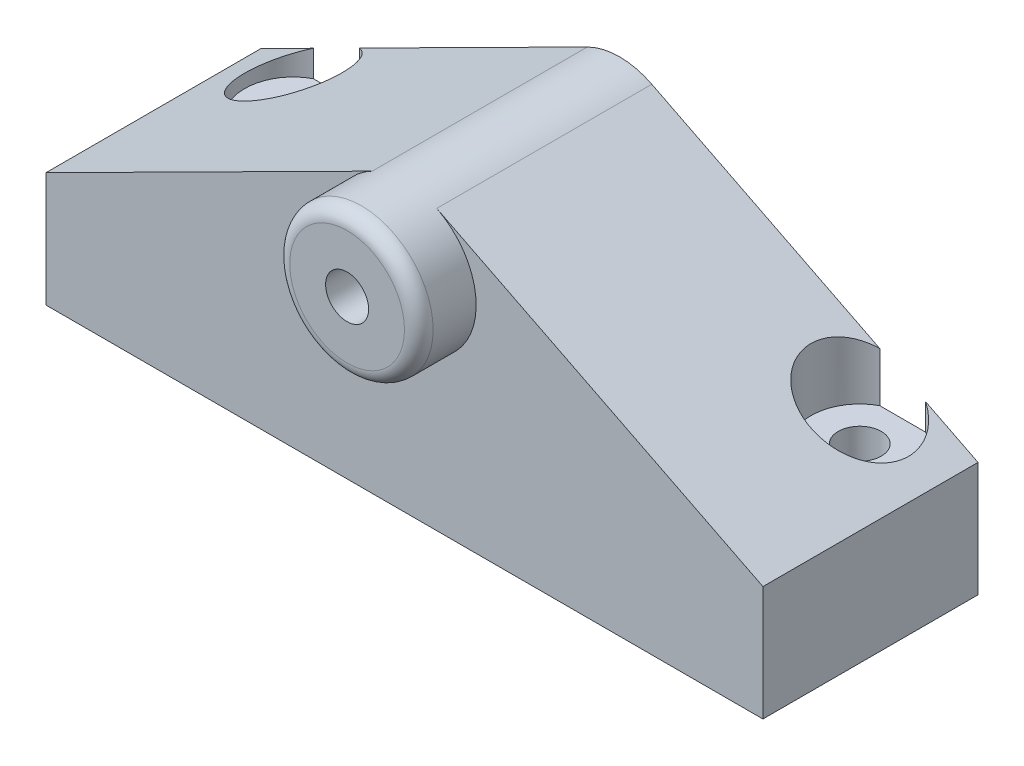
ISO-10303-21;
HEADER;
FILE_DESCRIPTION(('STEP AP214'),'2;1');
FILE_NAME('part.step','',(''),(''),'','','');
FILE_SCHEMA(('AUTOMOTIVE_DESIGN { 1 0 10303 214 1 1 1 1 }'));
ENDSEC;
DATA;
#1=APPLICATION_CONTEXT('core data for automotive mechanical design processes');
#2=APPLICATION_PROTOCOL_DEFINITION('international standard','automotive_design',2000,#1);
#3=PRODUCT_CONTEXT('',#1,'mechanical');
#4=PRODUCT('Part','Part','',(#3));
#5=PRODUCT_RELATED_PRODUCT_CATEGORY('part','',(#4));
#6=PRODUCT_DEFINITION_FORMATION('','',#4);
#7=PRODUCT_DEFINITION_CONTEXT('part definition',#1,'design');
#8=PRODUCT_DEFINITION('design','',#6,#7);
#9=PRODUCT_DEFINITION_SHAPE('','',#8);
#10=(LENGTH_UNIT() NAMED_UNIT(*) SI_UNIT(.MILLI.,.METRE.));
#11=(NAMED_UNIT(*) PLANE_ANGLE_UNIT() SI_UNIT($,.RADIAN.));
#12=(NAMED_UNIT(*) SI_UNIT($,.STERADIAN.) SOLID_ANGLE_UNIT());
#13=UNCERTAINTY_MEASURE_WITH_UNIT(LENGTH_MEASURE(1.E-05),#10,'distance_accuracy_value','');
#14=(GEOMETRIC_REPRESENTATION_CONTEXT(3) GLOBAL_UNCERTAINTY_ASSIGNED_CONTEXT((#13)) GLOBAL_UNIT_ASSIGNED_CONTEXT((#10,
#11,#12)) REPRESENTATION_CONTEXT('',''));
#15=CARTESIAN_POINT('',(0.,0.,0.));
#16=DIRECTION('',(0.,0.,1.));
#17=DIRECTION('',(1.,0.,0.));
#18=AXIS2_PLACEMENT_3D('',#15,#16,#17);
#19=CARTESIAN_POINT('',(25.0000000000154,14.9999999999695,15.));
#20=DIRECTION('',(0.,0.,1.));
#21=DIRECTION('',(1.,0.,0.));
#22=AXIS2_PLACEMENT_3D('',#19,#20,#21);
#23=PLANE('',#22);
#24=CARTESIAN_POINT('',(25.0000000000154,14.9999999999695,15.));
#25=DIRECTION('',(0.,0.,1.));
#26=DIRECTION('',(1.,0.,0.));
#27=AXIS2_PLACEMENT_3D('',#24,#25,#26);
#28=CIRCLE('',#27,5.);
#29=CARTESIAN_POINT('',(22.749789697054,19.4650367962845,15.));
#30=VERTEX_POINT('',#29);
#31=CARTESIAN_POINT('',(27.2502103029767,19.4650367962845,15.));
#32=VERTEX_POINT('',#31);
#33=EDGE_CURVE('E149',#30,#32,#28,.T.);
#34=ORIENTED_EDGE('',*,*,#33,.F.);
#35=DIRECTION('',(-0.893007359262992,-0.450042060592271,0.));
#36=VECTOR('',#35,1.);
#37=CARTESIAN_POINT('',(0.,8.,15.));
#38=LINE('',#37,#36);
#39=CARTESIAN_POINT('',(0.,8.,15.));
#40=VERTEX_POINT('',#39);
#41=EDGE_CURVE('E168',#30,#40,#38,.T.);
#42=ORIENTED_EDGE('',*,*,#41,.T.);
#43=DIRECTION('',(0.,-1.,0.));
#44=VECTOR('',#43,1.);
#45=CARTESIAN_POINT('',(0.,0.,15.));
#46=LINE('',#45,#44);
#47=CARTESIAN_POINT('',(0.,0.,15.));
#48=VERTEX_POINT('',#47);
#49=EDGE_CURVE('E157',#40,#48,#46,.T.);
#50=ORIENTED_EDGE('',*,*,#49,.T.);
#51=DIRECTION('',(1.,0.,0.));
#52=VECTOR('',#51,1.);
#53=CARTESIAN_POINT('',(0.,0.,15.));
#54=LINE('',#53,#52);
#55=CARTESIAN_POINT('',(50.0000000000308,0.,15.));
#56=VERTEX_POINT('',#55);
#57=EDGE_CURVE('E160',#48,#56,#54,.T.);
#58=ORIENTED_EDGE('',*,*,#57,.T.);
#59=DIRECTION('',(0.,1.,0.));
#60=VECTOR('',#59,1.);
#61=CARTESIAN_POINT('',(50.0000000000308,0.,15.));
#62=LINE('',#61,#60);
#63=CARTESIAN_POINT('',(50.0000000000308,8.,15.));
#64=VERTEX_POINT('',#63);
#65=EDGE_CURVE('E163',#56,#64,#62,.T.);
#66=ORIENTED_EDGE('',*,*,#65,.T.);
#67=DIRECTION('',(-0.893007359262992,0.450042060592271,0.));
#68=VECTOR('',#67,1.);
#69=CARTESIAN_POINT('',(50.0000000000308,8.,15.));
#70=LINE('',#69,#68);
#71=EDGE_CURVE('E165',#64,#32,#70,.T.);
#72=ORIENTED_EDGE('',*,*,#71,.T.);
#73=EDGE_LOOP('',(#34,#42,#50,#58,#66,#72));
#74=FACE_BOUND('',#73,.T.);
#75=ADVANCED_FACE('F32',(#74),#23,.T.);
#76=CARTESIAN_POINT('',(25.0000000000154,14.9999999999695,0.));
#77=DIRECTION('',(0.,0.,1.));
#78=DIRECTION('',(1.,0.,0.));
#79=AXIS2_PLACEMENT_3D('',#76,#77,#78);
#80=PLANE('',#79);
#81=DIRECTION('',(-0.893007359262992,-0.450042060592271,0.));
#82=VECTOR('',#81,1.);
#83=CARTESIAN_POINT('',(0.,8.,0.));
#84=LINE('',#83,#82);
#85=CARTESIAN_POINT('',(3.65000000001537,9.83946246817541,0.));
#86=VERTEX_POINT('',#85);
#87=CARTESIAN_POINT('',(0.,8.,0.));
#88=VERTEX_POINT('',#87);
#89=EDGE_CURVE('E183',#86,#88,#84,.T.);
#90=ORIENTED_EDGE('',*,*,#89,.F.);
#91=DIRECTION('',(0.,-1.,0.));
#92=VECTOR('',#91,1.);
#93=CARTESIAN_POINT('',(3.65000000001537,27.,0.));
#94=LINE('',#93,#92);
#95=CARTESIAN_POINT('',(3.65000000001537,8.,0.));
#96=VERTEX_POINT('',#95);
#97=EDGE_CURVE('E47',#86,#96,#94,.T.);
#98=ORIENTED_EDGE('',*,*,#97,.T.);
#99=DIRECTION('',(1.,0.,0.));
#100=VECTOR('',#99,1.);
#101=CARTESIAN_POINT('',(25.0000000000154,8.,0.));
#102=LINE('',#101,#100);
#103=CARTESIAN_POINT('',(6.85000000001537,8.,0.));
#104=VERTEX_POINT('',#103);
#105=EDGE_CURVE('E116',#96,#104,#102,.T.);
#106=ORIENTED_EDGE('',*,*,#105,.T.);
#107=DIRECTION('',(0.,-1.,0.));
#108=VECTOR('',#107,1.);
#109=CARTESIAN_POINT('',(6.85000000001537,27.,0.));
#110=LINE('',#109,#108);
#111=CARTESIAN_POINT('',(6.85000000001537,11.4521418923224,0.));
#112=VERTEX_POINT('',#111);
#113=EDGE_CURVE('E108',#104,#112,#110,.F.);
#114=ORIENTED_EDGE('',*,*,#113,.T.);
#115=CARTESIAN_POINT('',(22.749789697054,19.4650367962845,0.));
#116=VERTEX_POINT('',#115);
#117=EDGE_CURVE('E161',#116,#112,#84,.T.);
#118=ORIENTED_EDGE('',*,*,#117,.F.);
#119=CARTESIAN_POINT('',(25.0000000000154,14.9999999999695,0.));
#120=DIRECTION('',(0.,0.,1.));
#121=DIRECTION('',(1.,0.,0.));
#122=AXIS2_PLACEMENT_3D('',#119,#120,#121);
#123=CIRCLE('',#122,5.);
#124=CARTESIAN_POINT('',(27.2502103029767,19.4650367962845,0.));
#125=VERTEX_POINT('',#124);
#126=EDGE_CURVE('E181',#125,#116,#123,.T.);
#127=ORIENTED_EDGE('',*,*,#126,.F.);
#128=DIRECTION('',(-0.893007359262992,0.450042060592271,0.));
#129=VECTOR('',#128,1.);
#130=CARTESIAN_POINT('',(50.0000000000308,8.,0.));
#131=LINE('',#130,#129);
#132=CARTESIAN_POINT('',(43.1500000000154,11.4521418923224,0.));
#133=VERTEX_POINT('',#132);
#134=EDGE_CURVE('E177',#133,#125,#131,.T.);
#135=ORIENTED_EDGE('',*,*,#134,.F.);
#136=DIRECTION('',(0.,-1.,0.));
#137=VECTOR('',#136,1.);
#138=CARTESIAN_POINT('',(43.1500000000154,27.,0.));
#139=LINE('',#138,#137);
#140=CARTESIAN_POINT('',(43.1500000000154,8.,0.));
#141=VERTEX_POINT('',#140);
#142=EDGE_CURVE('E54',#133,#141,#139,.T.);
#143=ORIENTED_EDGE('',*,*,#142,.T.);
#144=DIRECTION('',(1.,0.,0.));
#145=VECTOR('',#144,1.);
#146=CARTESIAN_POINT('',(25.0000000000154,8.,0.));
#147=LINE('',#146,#145);
#148=CARTESIAN_POINT('',(46.3500000000154,8.,0.));
#149=VERTEX_POINT('',#148);
#150=EDGE_CURVE('E132',#141,#149,#147,.T.);
#151=ORIENTED_EDGE('',*,*,#150,.T.);
#152=DIRECTION('',(0.,-1.,0.));
#153=VECTOR('',#152,1.);
#154=CARTESIAN_POINT('',(46.3500000000154,27.,0.));
#155=LINE('',#154,#153);
#156=CARTESIAN_POINT('',(46.3500000000154,9.83946246817541,0.));
#157=VERTEX_POINT('',#156);
#158=EDGE_CURVE('E135',#149,#157,#155,.F.);
#159=ORIENTED_EDGE('',*,*,#158,.T.);
#160=CARTESIAN_POINT('',(50.0000000000308,8.,0.));
#161=VERTEX_POINT('',#160);
#162=EDGE_CURVE('E178',#161,#157,#131,.T.);
#163=ORIENTED_EDGE('',*,*,#162,.F.);
#164=DIRECTION('',(0.,1.,0.));
#165=VECTOR('',#164,1.);
#166=CARTESIAN_POINT('',(50.0000000000308,0.,0.));
#167=LINE('',#166,#165);
#168=CARTESIAN_POINT('',(50.0000000000308,0.,0.));
#169=VERTEX_POINT('',#168);
#170=EDGE_CURVE('E175',#169,#161,#167,.T.);
#171=ORIENTED_EDGE('',*,*,#170,.F.);
#172=DIRECTION('',(1.,0.,0.));
#173=VECTOR('',#172,1.);
#174=CARTESIAN_POINT('',(0.,0.,0.));
#175=LINE('',#174,#173);
#176=CARTESIAN_POINT('',(0.,0.,0.));
#177=VERTEX_POINT('',#176);
#178=EDGE_CURVE('E173',#177,#169,#175,.T.);
#179=ORIENTED_EDGE('',*,*,#178,.F.);
#180=DIRECTION('',(0.,-1.,0.));
#181=VECTOR('',#180,1.);
#182=CARTESIAN_POINT('',(0.,0.,0.));
#183=LINE('',#182,#181);
#184=EDGE_CURVE('E156',#88,#177,#183,.T.);
#185=ORIENTED_EDGE('',*,*,#184,.F.);
#186=EDGE_LOOP('',(#90,#98,#106,#114,#118,#127,#135,#143,#151,#159,#163,#171,#179,#185));
#187=FACE_BOUND('',#186,.T.);
#188=CARTESIAN_POINT('',(25.0000000000154,14.9999999999695,0.));
#189=DIRECTION('',(0.,0.,1.));
#190=DIRECTION('',(1.,0.,0.));
#191=AXIS2_PLACEMENT_3D('',#188,#189,#190);
#192=CIRCLE('',#191,1.5);
#193=CARTESIAN_POINT('',(26.5000000000154,14.9999999999695,0.));
#194=VERTEX_POINT('',#193);
#195=EDGE_CURVE('E148',#194,#194,#192,.T.);
#196=ORIENTED_EDGE('',*,*,#195,.T.);
#197=EDGE_LOOP('',(#196));
#198=FACE_BOUND('',#197,.T.);
#199=ADVANCED_FACE('F123',(#187,#198),#80,.F.);
#200=CARTESIAN_POINT('',(0.,0.,15.));
#201=DIRECTION('',(1.,0.,0.));
#202=DIRECTION('',(0.,0.,-1.));
#203=AXIS2_PLACEMENT_3D('',#200,#201,#202);
#204=PLANE('',#203);
#205=ORIENTED_EDGE('',*,*,#184,.T.);
#206=DIRECTION('',(0.,0.,-1.));
#207=VECTOR('',#206,1.);
#208=CARTESIAN_POINT('',(0.,0.,15.));
#209=LINE('',#208,#207);
#210=EDGE_CURVE('E153',#48,#177,#209,.T.);
#211=ORIENTED_EDGE('',*,*,#210,.F.);
#212=ORIENTED_EDGE('',*,*,#49,.F.);
#213=DIRECTION('',(0.,0.,-1.));
#214=VECTOR('',#213,1.);
#215=CARTESIAN_POINT('',(0.,8.,15.));
#216=LINE('',#215,#214);
#217=EDGE_CURVE('E170',#40,#88,#216,.T.);
#218=ORIENTED_EDGE('',*,*,#217,.T.);
#219=EDGE_LOOP('',(#205,#211,#212,#218));
#220=FACE_BOUND('',#219,.T.);
#221=ADVANCED_FACE('F249',(#220),#204,.F.);
#222=CARTESIAN_POINT('',(0.,0.,15.));
#223=DIRECTION('',(0.,1.,0.));
#224=DIRECTION('',(0.,0.,1.));
#225=AXIS2_PLACEMENT_3D('',#222,#223,#224);
#226=PLANE('',#225);
#227=CARTESIAN_POINT('',(44.7500000000154,0.,3.));
#228=DIRECTION('',(0.,-1.,0.));
#229=DIRECTION('',(0.,0.,-1.));
#230=AXIS2_PLACEMENT_3D('',#227,#228,#229);
#231=CIRCLE('',#230,1.5);
#232=CARTESIAN_POINT('',(44.7500000000154,0.,1.5));
#233=VERTEX_POINT('',#232);
#234=EDGE_CURVE('E139',#233,#233,#231,.T.);
#235=ORIENTED_EDGE('',*,*,#234,.F.);
#236=EDGE_LOOP('',(#235));
#237=FACE_BOUND('',#236,.T.);
#238=CARTESIAN_POINT('',(5.25000000001537,0.,3.));
#239=DIRECTION('',(0.,-1.,0.));
#240=DIRECTION('',(0.,0.,-1.));
#241=AXIS2_PLACEMENT_3D('',#238,#239,#240);
#242=CIRCLE('',#241,1.5);
#243=CARTESIAN_POINT('',(5.25000000001537,0.,1.5));
#244=VERTEX_POINT('',#243);
#245=EDGE_CURVE('E142',#244,#244,#242,.T.);
#246=ORIENTED_EDGE('',*,*,#245,.F.);
#247=EDGE_LOOP('',(#246));
#248=FACE_BOUND('',#247,.T.);
#249=ORIENTED_EDGE('',*,*,#178,.T.);
#250=DIRECTION('',(0.,0.,-1.));
#251=VECTOR('',#250,1.);
#252=CARTESIAN_POINT('',(50.0000000000308,0.,15.));
#253=LINE('',#252,#251);
#254=EDGE_CURVE('E196',#56,#169,#253,.T.);
#255=ORIENTED_EDGE('',*,*,#254,.F.);
#256=ORIENTED_EDGE('',*,*,#57,.F.);
#257=ORIENTED_EDGE('',*,*,#210,.T.);
#258=EDGE_LOOP('',(#249,#255,#256,#257));
#259=FACE_BOUND('',#258,.T.);
#260=ADVANCED_FACE('F265',(#237,#248,#259),#226,.F.);
#261=CARTESIAN_POINT('',(50.0000000000308,0.,15.));
#262=DIRECTION('',(-1.,0.,0.));
#263=DIRECTION('',(0.,0.,1.));
#264=AXIS2_PLACEMENT_3D('',#261,#262,#263);
#265=PLANE('',#264);
#266=ORIENTED_EDGE('',*,*,#170,.T.);
#267=DIRECTION('',(0.,0.,-1.));
#268=VECTOR('',#267,1.);
#269=CARTESIAN_POINT('',(50.0000000000308,8.,15.));
#270=LINE('',#269,#268);
#271=EDGE_CURVE('E193',#64,#161,#270,.T.);
#272=ORIENTED_EDGE('',*,*,#271,.F.);
#273=ORIENTED_EDGE('',*,*,#65,.F.);
#274=ORIENTED_EDGE('',*,*,#254,.T.);
#275=EDGE_LOOP('',(#266,#272,#273,#274));
#276=FACE_BOUND('',#275,.T.);
#277=ADVANCED_FACE('F262',(#276),#265,.F.);
#278=CARTESIAN_POINT('',(50.0000000000308,8.,15.));
#279=DIRECTION('',(-0.450042060592271,-0.893007359262992,0.));
#280=DIRECTION('',(0.893007359262992,-0.450042060592272,0.));
#281=AXIS2_PLACEMENT_3D('',#278,#279,#280);
#282=PLANE('',#281);
#283=ORIENTED_EDGE('',*,*,#162,.T.);
#284=CARTESIAN_POINT('',(44.7500000000154,10.6458021802489,3.));
#285=DIRECTION('',(-0.450042060592271,-0.893007359262992,0.));
#286=DIRECTION('',(0.893007359262992,-0.450042060592272,0.));
#287=AXIS2_PLACEMENT_3D('',#284,#285,#286);
#288=ELLIPSE('',#287,3.80735944080691,3.4);
#289=EDGE_CURVE('E40',#157,#133,#288,.T.);
#290=ORIENTED_EDGE('',*,*,#289,.T.);
#291=ORIENTED_EDGE('',*,*,#134,.T.);
#292=DIRECTION('',(0.,0.,-1.));
#293=VECTOR('',#292,1.);
#294=CARTESIAN_POINT('',(27.2502103029767,19.4650367962845,15.));
#295=LINE('',#294,#293);
#296=EDGE_CURVE('E190',#32,#125,#295,.T.);
#297=ORIENTED_EDGE('',*,*,#296,.F.);
#298=ORIENTED_EDGE('',*,*,#71,.F.);
#299=ORIENTED_EDGE('',*,*,#271,.T.);
#300=EDGE_LOOP('',(#283,#290,#291,#297,#298,#299));
#301=FACE_BOUND('',#300,.T.);
#302=ADVANCED_FACE('F210',(#301),#282,.F.);
#303=CARTESIAN_POINT('',(25.0000000000154,14.9999999999695,15.));
#304=DIRECTION('',(0.,0.,-1.));
#305=DIRECTION('',(-1.,0.,0.));
#306=AXIS2_PLACEMENT_3D('',#303,#304,#305);
#307=CYLINDRICAL_SURFACE('',#306,5.);
#308=CARTESIAN_POINT('',(25.0000000000154,14.9999999999695,18.));
#309=DIRECTION('',(0.,0.,1.));
#310=DIRECTION('',(1.,0.,0.));
#311=AXIS2_PLACEMENT_3D('',#308,#309,#310);
#312=CIRCLE('',#311,5.);
#313=CARTESIAN_POINT('',(30.0000000000154,14.9999999999695,18.));
#314=VERTEX_POINT('',#313);
#315=EDGE_CURVE('E203',#314,#314,#312,.F.);
#316=ORIENTED_EDGE('',*,*,#315,.T.);
#317=EDGE_LOOP('',(#316));
#318=FACE_BOUND('',#317,.T.);
#319=ORIENTED_EDGE('',*,*,#126,.T.);
#320=DIRECTION('',(0.,0.,-1.));
#321=VECTOR('',#320,1.);
#322=CARTESIAN_POINT('',(22.749789697054,19.4650367962845,15.));
#323=LINE('',#322,#321);
#324=EDGE_CURVE('E187',#30,#116,#323,.T.);
#325=ORIENTED_EDGE('',*,*,#324,.F.);
#326=ORIENTED_EDGE('',*,*,#33,.T.);
#327=ORIENTED_EDGE('',*,*,#296,.T.);
#328=EDGE_LOOP('',(#319,#325,#326,#327));
#329=FACE_BOUND('',#328,.T.);
#330=ADVANCED_FACE('F215',(#318,#329),#307,.T.);
#331=CARTESIAN_POINT('',(0.,8.,15.));
#332=DIRECTION('',(0.450042060592271,-0.893007359262992,0.));
#333=DIRECTION('',(0.893007359262992,0.450042060592272,0.));
#334=AXIS2_PLACEMENT_3D('',#331,#332,#333);
#335=PLANE('',#334);
#336=ORIENTED_EDGE('',*,*,#117,.T.);
#337=CARTESIAN_POINT('',(5.25000000001537,10.6458021802489,3.));
#338=DIRECTION('',(0.450042060592271,-0.893007359262992,0.));
#339=DIRECTION('',(-0.893007359262992,-0.450042060592272,0.));
#340=AXIS2_PLACEMENT_3D('',#337,#338,#339);
#341=ELLIPSE('',#340,3.80735944080691,3.4);
#342=EDGE_CURVE('E11',#112,#86,#341,.T.);
#343=ORIENTED_EDGE('',*,*,#342,.T.);
#344=ORIENTED_EDGE('',*,*,#89,.T.);
#345=ORIENTED_EDGE('',*,*,#217,.F.);
#346=ORIENTED_EDGE('',*,*,#41,.F.);
#347=ORIENTED_EDGE('',*,*,#324,.T.);
#348=EDGE_LOOP('',(#336,#343,#344,#345,#346,#347));
#349=FACE_BOUND('',#348,.T.);
#350=ADVANCED_FACE('F218',(#349),#335,.F.);
#351=CARTESIAN_POINT('',(25.0000000000154,14.9999999999695,15.));
#352=DIRECTION('',(0.,0.,-1.));
#353=DIRECTION('',(-1.,0.,0.));
#354=AXIS2_PLACEMENT_3D('',#351,#352,#353);
#355=CYLINDRICAL_SURFACE('',#354,1.5);
#356=ORIENTED_EDGE('',*,*,#195,.F.);
#357=EDGE_LOOP('',(#356));
#358=FACE_BOUND('',#357,.T.);
#359=CARTESIAN_POINT('',(25.0000000000154,14.9999999999695,19.));
#360=DIRECTION('',(0.,0.,1.));
#361=DIRECTION('',(1.,0.,0.));
#362=AXIS2_PLACEMENT_3D('',#359,#360,#361);
#363=CIRCLE('',#362,1.5);
#364=CARTESIAN_POINT('',(26.5000000000154,14.9999999999695,19.));
#365=VERTEX_POINT('',#364);
#366=EDGE_CURVE('E145',#365,#365,#363,.T.);
#367=ORIENTED_EDGE('',*,*,#366,.T.);
#368=EDGE_LOOP('',(#367));
#369=FACE_BOUND('',#368,.T.);
#370=ADVANCED_FACE('F252',(#358,#369),#355,.F.);
#371=CARTESIAN_POINT('',(25.0000000000154,14.9999999999695,19.));
#372=DIRECTION('',(0.,0.,1.));
#373=DIRECTION('',(1.,0.,0.));
#374=AXIS2_PLACEMENT_3D('',#371,#372,#373);
#375=PLANE('',#374);
#376=CARTESIAN_POINT('',(25.0000000000154,14.9999999999695,19.));
#377=DIRECTION('',(0.,0.,1.));
#378=DIRECTION('',(1.,0.,0.));
#379=AXIS2_PLACEMENT_3D('',#376,#377,#378);
#380=CIRCLE('',#379,4.);
#381=CARTESIAN_POINT('',(29.0000000000154,14.9999999999695,19.));
#382=VERTEX_POINT('',#381);
#383=EDGE_CURVE('E152',#382,#382,#380,.T.);
#384=ORIENTED_EDGE('',*,*,#383,.T.);
#385=EDGE_LOOP('',(#384));
#386=FACE_BOUND('',#385,.T.);
#387=ORIENTED_EDGE('',*,*,#366,.F.);
#388=EDGE_LOOP('',(#387));
#389=FACE_BOUND('',#388,.T.);
#390=ADVANCED_FACE('F306',(#386,#389),#375,.T.);
#391=CARTESIAN_POINT('',(25.0000000000154,14.9999999999695,18.));
#392=DIRECTION('',(0.,0.,1.));
#393=DIRECTION('',(1.,0.,0.));
#394=AXIS2_PLACEMENT_3D('',#391,#392,#393);
#395=TOROIDAL_SURFACE('',#394,4.,1.);
#396=ORIENTED_EDGE('',*,*,#315,.F.);
#397=EDGE_LOOP('',(#396));
#398=FACE_BOUND('',#397,.T.);
#399=ORIENTED_EDGE('',*,*,#383,.F.);
#400=EDGE_LOOP('',(#399));
#401=FACE_BOUND('',#400,.T.);
#402=ADVANCED_FACE('F34',(#398,#401),#395,.T.);
#403=CARTESIAN_POINT('',(5.25000000001537,19.,3.));
#404=DIRECTION('',(0.,-1.,0.));
#405=DIRECTION('',(0.,0.,-1.));
#406=AXIS2_PLACEMENT_3D('',#403,#404,#405);
#407=CYLINDRICAL_SURFACE('',#406,1.5);
#408=CARTESIAN_POINT('',(5.25000000001537,8.,3.));
#409=DIRECTION('',(0.,-1.,0.));
#410=DIRECTION('',(0.,0.,-1.));
#411=AXIS2_PLACEMENT_3D('',#408,#409,#410);
#412=CIRCLE('',#411,1.5);
#413=CARTESIAN_POINT('',(5.25000000001537,8.,1.5));
#414=VERTEX_POINT('',#413);
#415=EDGE_CURVE('E120',#414,#414,#412,.F.);
#416=ORIENTED_EDGE('',*,*,#415,.T.);
#417=EDGE_LOOP('',(#416));
#418=FACE_BOUND('',#417,.T.);
#419=ORIENTED_EDGE('',*,*,#245,.T.);
#420=EDGE_LOOP('',(#419));
#421=FACE_BOUND('',#420,.T.);
#422=ADVANCED_FACE('F317',(#418,#421),#407,.F.);
#423=CARTESIAN_POINT('',(44.7500000000154,19.,3.));
#424=DIRECTION('',(0.,-1.,0.));
#425=DIRECTION('',(0.,0.,-1.));
#426=AXIS2_PLACEMENT_3D('',#423,#424,#425);
#427=CYLINDRICAL_SURFACE('',#426,1.5);
#428=CARTESIAN_POINT('',(44.7500000000154,8.,3.));
#429=DIRECTION('',(0.,-1.,0.));
#430=DIRECTION('',(0.,0.,-1.));
#431=AXIS2_PLACEMENT_3D('',#428,#429,#430);
#432=CIRCLE('',#431,1.5);
#433=CARTESIAN_POINT('',(44.7500000000154,8.,1.5));
#434=VERTEX_POINT('',#433);
#435=EDGE_CURVE('E131',#434,#434,#432,.F.);
#436=ORIENTED_EDGE('',*,*,#435,.T.);
#437=EDGE_LOOP('',(#436));
#438=FACE_BOUND('',#437,.T.);
#439=ORIENTED_EDGE('',*,*,#234,.T.);
#440=EDGE_LOOP('',(#439));
#441=FACE_BOUND('',#440,.T.);
#442=ADVANCED_FACE('F240',(#438,#441),#427,.F.);
#443=CARTESIAN_POINT('',(44.7500000000154,27.,3.));
#444=DIRECTION('',(0.,-1.,0.));
#445=DIRECTION('',(0.,0.,-1.));
#446=AXIS2_PLACEMENT_3D('',#443,#444,#445);
#447=CYLINDRICAL_SURFACE('',#446,3.4);
#448=ORIENTED_EDGE('',*,*,#289,.F.);
#449=ORIENTED_EDGE('',*,*,#158,.F.);
#450=CARTESIAN_POINT('',(44.7500000000154,8.,3.));
#451=DIRECTION('',(0.,-1.,0.));
#452=DIRECTION('',(0.,0.,-1.));
#453=AXIS2_PLACEMENT_3D('',#450,#451,#452);
#454=CIRCLE('',#453,3.4);
#455=EDGE_CURVE('E129',#149,#141,#454,.T.);
#456=ORIENTED_EDGE('',*,*,#455,.T.);
#457=ORIENTED_EDGE('',*,*,#142,.F.);
#458=EDGE_LOOP('',(#448,#449,#456,#457));
#459=FACE_BOUND('',#458,.T.);
#460=ADVANCED_FACE('F229',(#459),#447,.F.);
#461=CARTESIAN_POINT('',(44.7500000000154,8.,3.));
#462=DIRECTION('',(0.,-1.,0.));
#463=DIRECTION('',(0.,0.,-1.));
#464=AXIS2_PLACEMENT_3D('',#461,#462,#463);
#465=PLANE('',#464);
#466=ORIENTED_EDGE('',*,*,#435,.F.);
#467=EDGE_LOOP('',(#466));
#468=FACE_BOUND('',#467,.T.);
#469=ORIENTED_EDGE('',*,*,#455,.F.);
#470=ORIENTED_EDGE('',*,*,#150,.F.);
#471=EDGE_LOOP('',(#469,#470));
#472=FACE_BOUND('',#471,.T.);
#473=ADVANCED_FACE('F231',(#468,#472),#465,.F.);
#474=CARTESIAN_POINT('',(5.25000000001537,27.,3.));
#475=DIRECTION('',(0.,-1.,0.));
#476=DIRECTION('',(0.,0.,-1.));
#477=AXIS2_PLACEMENT_3D('',#474,#475,#476);
#478=CYLINDRICAL_SURFACE('',#477,3.4);
#479=ORIENTED_EDGE('',*,*,#342,.F.);
#480=ORIENTED_EDGE('',*,*,#113,.F.);
#481=CARTESIAN_POINT('',(5.25000000001537,8.,3.));
#482=DIRECTION('',(0.,-1.,0.));
#483=DIRECTION('',(0.,0.,-1.));
#484=AXIS2_PLACEMENT_3D('',#481,#482,#483);
#485=CIRCLE('',#484,3.4);
#486=EDGE_CURVE('E111',#104,#96,#485,.T.);
#487=ORIENTED_EDGE('',*,*,#486,.T.);
#488=ORIENTED_EDGE('',*,*,#97,.F.);
#489=EDGE_LOOP('',(#479,#480,#487,#488));
#490=FACE_BOUND('',#489,.T.);
#491=ADVANCED_FACE('F110',(#490),#478,.F.);
#492=CARTESIAN_POINT('',(5.25000000001537,8.,3.));
#493=DIRECTION('',(0.,-1.,0.));
#494=DIRECTION('',(0.,0.,-1.));
#495=AXIS2_PLACEMENT_3D('',#492,#493,#494);
#496=PLANE('',#495);
#497=ORIENTED_EDGE('',*,*,#415,.F.);
#498=EDGE_LOOP('',(#497));
#499=FACE_BOUND('',#498,.T.);
#500=ORIENTED_EDGE('',*,*,#486,.F.);
#501=ORIENTED_EDGE('',*,*,#105,.F.);
#502=EDGE_LOOP('',(#500,#501));
#503=FACE_BOUND('',#502,.T.);
#504=ADVANCED_FACE('F119',(#499,#503),#496,.F.);
#505=CLOSED_SHELL('',(#75,#199,#221,#260,#277,#302,#330,#350,#370,#390,#402,#422,#442,#460,#473,
#491,#504));
#506=MANIFOLD_SOLID_BREP('B2',#505);
#507=ADVANCED_BREP_SHAPE_REPRESENTATION('',(#18,#506),#14);
#508=SHAPE_DEFINITION_REPRESENTATION(#9,#507);
ENDSEC;
END-ISO-10303-21;
